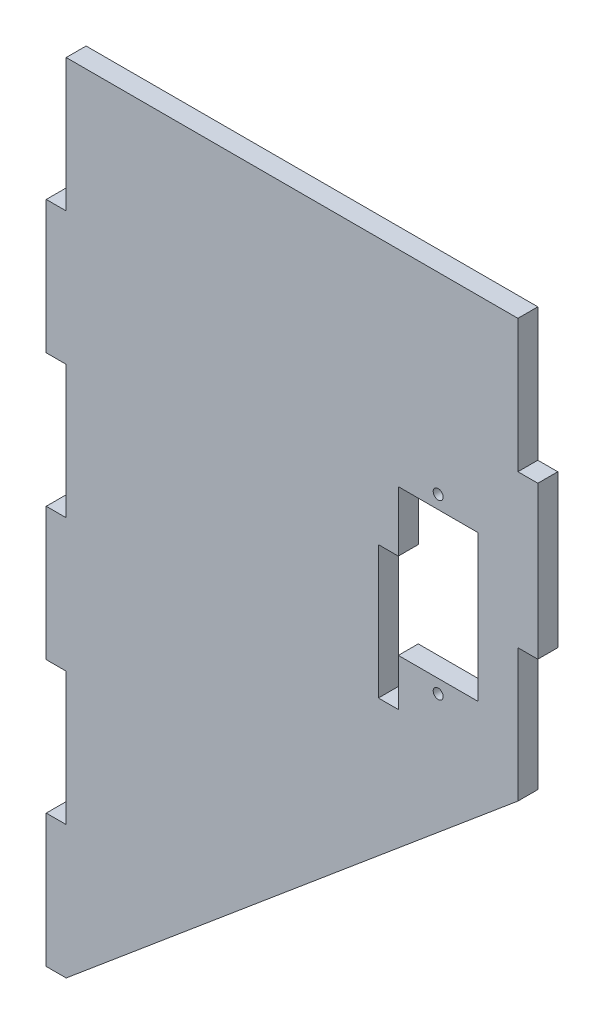
ISO-10303-21;
HEADER;
FILE_DESCRIPTION(('STEP AP214'),'2;1');
FILE_NAME('part.step','',(''),(''),'','','');
FILE_SCHEMA(('AUTOMOTIVE_DESIGN { 1 0 10303 214 1 1 1 1 }'));
ENDSEC;
DATA;
#1=APPLICATION_CONTEXT('core data for automotive mechanical design processes');
#2=APPLICATION_PROTOCOL_DEFINITION('international standard','automotive_design',2000,#1);
#3=PRODUCT_CONTEXT('',#1,'mechanical');
#4=PRODUCT('Part','Part','',(#3));
#5=PRODUCT_RELATED_PRODUCT_CATEGORY('part','',(#4));
#6=PRODUCT_DEFINITION_FORMATION('','',#4);
#7=PRODUCT_DEFINITION_CONTEXT('part definition',#1,'design');
#8=PRODUCT_DEFINITION('design','',#6,#7);
#9=PRODUCT_DEFINITION_SHAPE('','',#8);
#10=(LENGTH_UNIT() NAMED_UNIT(*) SI_UNIT(.MILLI.,.METRE.));
#11=(NAMED_UNIT(*) PLANE_ANGLE_UNIT() SI_UNIT($,.RADIAN.));
#12=(NAMED_UNIT(*) SI_UNIT($,.STERADIAN.) SOLID_ANGLE_UNIT());
#13=UNCERTAINTY_MEASURE_WITH_UNIT(LENGTH_MEASURE(1.E-05),#10,'distance_accuracy_value','');
#14=(GEOMETRIC_REPRESENTATION_CONTEXT(3) GLOBAL_UNCERTAINTY_ASSIGNED_CONTEXT((#13)) GLOBAL_UNIT_ASSIGNED_CONTEXT((#10,
#11,#12)) REPRESENTATION_CONTEXT('',''));
#15=CARTESIAN_POINT('',(0.,0.,0.));
#16=DIRECTION('',(0.,0.,1.));
#17=DIRECTION('',(1.,0.,0.));
#18=AXIS2_PLACEMENT_3D('',#15,#16,#17);
#19=CARTESIAN_POINT('',(0.,0.,3.));
#20=DIRECTION('',(0.,0.,-1.));
#21=DIRECTION('',(-1.,0.,0.));
#22=AXIS2_PLACEMENT_3D('',#19,#20,#21);
#23=PLANE('',#22);
#24=DIRECTION('',(1.,0.,0.));
#25=VECTOR('',#24,1.);
#26=CARTESIAN_POINT('',(-3.00000000000001,40.,3.));
#27=LINE('',#26,#25);
#28=CARTESIAN_POINT('',(-3.00000000000001,40.,3.));
#29=VERTEX_POINT('',#28);
#30=CARTESIAN_POINT('',(0.,40.,3.));
#31=VERTEX_POINT('',#30);
#32=EDGE_CURVE('E280',#29,#31,#27,.T.);
#33=ORIENTED_EDGE('',*,*,#32,.T.);
#34=DIRECTION('',(0.,-1.,0.));
#35=VECTOR('',#34,1.);
#36=CARTESIAN_POINT('',(0.,40.,3.));
#37=LINE('',#36,#35);
#38=CARTESIAN_POINT('',(0.,20.,3.));
#39=VERTEX_POINT('',#38);
#40=EDGE_CURVE('E283',#31,#39,#37,.T.);
#41=ORIENTED_EDGE('',*,*,#40,.T.);
#42=DIRECTION('',(-1.,0.,0.));
#43=VECTOR('',#42,1.);
#44=CARTESIAN_POINT('',(0.,20.,3.));
#45=LINE('',#44,#43);
#46=CARTESIAN_POINT('',(-3.,20.,3.));
#47=VERTEX_POINT('',#46);
#48=EDGE_CURVE('E286',#39,#47,#45,.T.);
#49=ORIENTED_EDGE('',*,*,#48,.T.);
#50=DIRECTION('',(0.,-1.,0.));
#51=VECTOR('',#50,1.);
#52=CARTESIAN_POINT('',(-3.,20.,3.));
#53=LINE('',#52,#51);
#54=CARTESIAN_POINT('',(-3.,0.,3.));
#55=VERTEX_POINT('',#54);
#56=EDGE_CURVE('E288',#47,#55,#53,.T.);
#57=ORIENTED_EDGE('',*,*,#56,.T.);
#58=DIRECTION('',(1.,0.,0.));
#59=VECTOR('',#58,1.);
#60=CARTESIAN_POINT('',(-3.,0.,3.));
#61=LINE('',#60,#59);
#62=CARTESIAN_POINT('',(0.,0.,3.));
#63=VERTEX_POINT('',#62);
#64=EDGE_CURVE('E290',#55,#63,#61,.T.);
#65=ORIENTED_EDGE('',*,*,#64,.T.);
#66=DIRECTION('',(0.766044443118977,0.642787609686541,0.));
#67=VECTOR('',#66,1.);
#68=CARTESIAN_POINT('',(0.,0.,3.));
#69=LINE('',#68,#67);
#70=CARTESIAN_POINT('',(68.,57.0587749200552,3.));
#71=VERTEX_POINT('',#70);
#72=EDGE_CURVE('E292',#63,#71,#69,.T.);
#73=ORIENTED_EDGE('',*,*,#72,.T.);
#74=DIRECTION('',(0.,1.,0.));
#75=VECTOR('',#74,1.);
#76=CARTESIAN_POINT('',(68.,57.0587749200552,3.));
#77=LINE('',#76,#75);
#78=CARTESIAN_POINT('',(68.,77.0587749200552,3.));
#79=VERTEX_POINT('',#78);
#80=EDGE_CURVE('E294',#71,#79,#77,.T.);
#81=ORIENTED_EDGE('',*,*,#80,.T.);
#82=DIRECTION('',(1.,0.,0.));
#83=VECTOR('',#82,1.);
#84=CARTESIAN_POINT('',(68.,77.0587749200552,3.));
#85=LINE('',#84,#83);
#86=CARTESIAN_POINT('',(71.,77.0587749200552,3.));
#87=VERTEX_POINT('',#86);
#88=EDGE_CURVE('E296',#79,#87,#85,.T.);
#89=ORIENTED_EDGE('',*,*,#88,.T.);
#90=DIRECTION('',(0.,1.,0.));
#91=VECTOR('',#90,1.);
#92=CARTESIAN_POINT('',(71.,77.0587749200552,3.));
#93=LINE('',#92,#91);
#94=CARTESIAN_POINT('',(71.,100.,3.));
#95=VERTEX_POINT('',#94);
#96=EDGE_CURVE('E298',#87,#95,#93,.T.);
#97=ORIENTED_EDGE('',*,*,#96,.T.);
#98=DIRECTION('',(-1.,0.,0.));
#99=VECTOR('',#98,1.);
#100=CARTESIAN_POINT('',(71.,100.,3.));
#101=LINE('',#100,#99);
#102=CARTESIAN_POINT('',(68.,100.,3.));
#103=VERTEX_POINT('',#102);
#104=EDGE_CURVE('E300',#95,#103,#101,.T.);
#105=ORIENTED_EDGE('',*,*,#104,.T.);
#106=DIRECTION('',(0.,1.,0.));
#107=VECTOR('',#106,1.);
#108=CARTESIAN_POINT('',(68.,100.,3.));
#109=LINE('',#108,#107);
#110=CARTESIAN_POINT('',(68.,120.,3.));
#111=VERTEX_POINT('',#110);
#112=EDGE_CURVE('E302',#103,#111,#109,.T.);
#113=ORIENTED_EDGE('',*,*,#112,.T.);
#114=DIRECTION('',(-1.,0.,0.));
#115=VECTOR('',#114,1.);
#116=CARTESIAN_POINT('',(23.5,120.,3.));
#117=LINE('',#116,#115);
#118=CARTESIAN_POINT('',(0.,120.,3.));
#119=VERTEX_POINT('',#118);
#120=EDGE_CURVE('E304',#111,#119,#117,.T.);
#121=ORIENTED_EDGE('',*,*,#120,.T.);
#122=DIRECTION('',(0.,-1.,0.));
#123=VECTOR('',#122,1.);
#124=CARTESIAN_POINT('',(0.,100.,3.));
#125=LINE('',#124,#123);
#126=CARTESIAN_POINT('',(0.,100.,3.));
#127=VERTEX_POINT('',#126);
#128=EDGE_CURVE('E306',#119,#127,#125,.T.);
#129=ORIENTED_EDGE('',*,*,#128,.T.);
#130=DIRECTION('',(-1.,0.,0.));
#131=VECTOR('',#130,1.);
#132=CARTESIAN_POINT('',(-3.00000000000001,100.,3.));
#133=LINE('',#132,#131);
#134=CARTESIAN_POINT('',(-3.00000000000001,100.,3.));
#135=VERTEX_POINT('',#134);
#136=EDGE_CURVE('E308',#127,#135,#133,.T.);
#137=ORIENTED_EDGE('',*,*,#136,.T.);
#138=DIRECTION('',(0.,-1.,0.));
#139=VECTOR('',#138,1.);
#140=CARTESIAN_POINT('',(-3.,80.,3.));
#141=LINE('',#140,#139);
#142=CARTESIAN_POINT('',(-3.,80.,3.));
#143=VERTEX_POINT('',#142);
#144=EDGE_CURVE('E310',#135,#143,#141,.T.);
#145=ORIENTED_EDGE('',*,*,#144,.T.);
#146=DIRECTION('',(1.,0.,0.));
#147=VECTOR('',#146,1.);
#148=CARTESIAN_POINT('',(0.,80.,3.));
#149=LINE('',#148,#147);
#150=CARTESIAN_POINT('',(0.,80.,3.));
#151=VERTEX_POINT('',#150);
#152=EDGE_CURVE('E312',#143,#151,#149,.T.);
#153=ORIENTED_EDGE('',*,*,#152,.T.);
#154=DIRECTION('',(0.,-1.,0.));
#155=VECTOR('',#154,1.);
#156=CARTESIAN_POINT('',(0.,60.,3.));
#157=LINE('',#156,#155);
#158=CARTESIAN_POINT('',(0.,60.,3.));
#159=VERTEX_POINT('',#158);
#160=EDGE_CURVE('E314',#151,#159,#157,.T.);
#161=ORIENTED_EDGE('',*,*,#160,.T.);
#162=DIRECTION('',(-1.,0.,0.));
#163=VECTOR('',#162,1.);
#164=CARTESIAN_POINT('',(-3.00000000000001,60.,3.));
#165=LINE('',#164,#163);
#166=CARTESIAN_POINT('',(-3.00000000000001,60.,3.));
#167=VERTEX_POINT('',#166);
#168=EDGE_CURVE('E316',#159,#167,#165,.T.);
#169=ORIENTED_EDGE('',*,*,#168,.T.);
#170=DIRECTION('',(0.,-1.,0.));
#171=VECTOR('',#170,1.);
#172=CARTESIAN_POINT('',(-3.00000000000001,60.,3.));
#173=LINE('',#172,#171);
#174=EDGE_CURVE('E318',#167,#29,#173,.T.);
#175=ORIENTED_EDGE('',*,*,#174,.T.);
#176=EDGE_LOOP('',(#33,#41,#49,#57,#65,#73,#81,#89,#97,#105,#113,#121,#129,#137,#145,#153,#161,
#169,#175));
#177=FACE_BOUND('',#176,.T.);
#178=DIRECTION('',(0.,-1.,0.));
#179=VECTOR('',#178,1.);
#180=CARTESIAN_POINT('',(50.,89.0587749200552,3.));
#181=LINE('',#180,#179);
#182=CARTESIAN_POINT('',(50.,89.0587749200552,3.));
#183=VERTEX_POINT('',#182);
#184=CARTESIAN_POINT('',(50.,80.,3.));
#185=VERTEX_POINT('',#184);
#186=EDGE_CURVE('E212',#183,#185,#181,.T.);
#187=ORIENTED_EDGE('',*,*,#186,.F.);
#188=DIRECTION('',(-1.,0.,0.));
#189=VECTOR('',#188,1.);
#190=CARTESIAN_POINT('',(50.,89.0587749200552,3.));
#191=LINE('',#190,#189);
#192=CARTESIAN_POINT('',(62.,89.0587749200552,3.));
#193=VERTEX_POINT('',#192);
#194=EDGE_CURVE('E247',#193,#183,#191,.T.);
#195=ORIENTED_EDGE('',*,*,#194,.F.);
#196=DIRECTION('',(0.,1.,0.));
#197=VECTOR('',#196,1.);
#198=CARTESIAN_POINT('',(62.,89.0587749200552,3.));
#199=LINE('',#198,#197);
#200=CARTESIAN_POINT('',(62.,67.0587749200552,3.));
#201=VERTEX_POINT('',#200);
#202=EDGE_CURVE('E245',#201,#193,#199,.T.);
#203=ORIENTED_EDGE('',*,*,#202,.F.);
#204=DIRECTION('',(1.,0.,0.));
#205=VECTOR('',#204,1.);
#206=CARTESIAN_POINT('',(50.,67.0587749200552,3.));
#207=LINE('',#206,#205);
#208=CARTESIAN_POINT('',(50.,67.0587749200552,3.));
#209=VERTEX_POINT('',#208);
#210=EDGE_CURVE('E243',#209,#201,#207,.T.);
#211=ORIENTED_EDGE('',*,*,#210,.F.);
#212=DIRECTION('',(0.,1.,0.));
#213=VECTOR('',#212,1.);
#214=CARTESIAN_POINT('',(50.,60.,3.));
#215=LINE('',#214,#213);
#216=CARTESIAN_POINT('',(50.,60.,3.));
#217=VERTEX_POINT('',#216);
#218=EDGE_CURVE('E241',#217,#209,#215,.T.);
#219=ORIENTED_EDGE('',*,*,#218,.F.);
#220=DIRECTION('',(1.,0.,0.));
#221=VECTOR('',#220,1.);
#222=CARTESIAN_POINT('',(50.,60.,3.));
#223=LINE('',#222,#221);
#224=CARTESIAN_POINT('',(47.,60.,3.));
#225=VERTEX_POINT('',#224);
#226=EDGE_CURVE('E236',#225,#217,#223,.T.);
#227=ORIENTED_EDGE('',*,*,#226,.F.);
#228=DIRECTION('',(0.,-1.,0.));
#229=VECTOR('',#228,1.);
#230=CARTESIAN_POINT('',(47.,60.,3.));
#231=LINE('',#230,#229);
#232=CARTESIAN_POINT('',(47.,80.,3.));
#233=VERTEX_POINT('',#232);
#234=EDGE_CURVE('E234',#233,#225,#231,.T.);
#235=ORIENTED_EDGE('',*,*,#234,.F.);
#236=DIRECTION('',(-1.,0.,0.));
#237=VECTOR('',#236,1.);
#238=CARTESIAN_POINT('',(47.,80.,3.));
#239=LINE('',#238,#237);
#240=EDGE_CURVE('E220',#185,#233,#239,.T.);
#241=ORIENTED_EDGE('',*,*,#240,.F.);
#242=EDGE_LOOP('',(#187,#195,#203,#211,#219,#227,#235,#241));
#243=FACE_BOUND('',#242,.T.);
#244=CARTESIAN_POINT('',(56.,91.0587749200552,3.));
#245=DIRECTION('',(0.,0.,1.));
#246=DIRECTION('',(1.,0.,0.));
#247=AXIS2_PLACEMENT_3D('',#244,#245,#246);
#248=CIRCLE('',#247,0.749999999999999);
#249=CARTESIAN_POINT('',(56.75,91.0587749200552,3.));
#250=VERTEX_POINT('',#249);
#251=EDGE_CURVE('E250',#250,#250,#248,.T.);
#252=ORIENTED_EDGE('',*,*,#251,.F.);
#253=EDGE_LOOP('',(#252));
#254=FACE_BOUND('',#253,.T.);
#255=CARTESIAN_POINT('',(56.,65.0587749200552,3.));
#256=DIRECTION('',(0.,0.,1.));
#257=DIRECTION('',(-1.,0.,0.));
#258=AXIS2_PLACEMENT_3D('',#255,#256,#257);
#259=CIRCLE('',#258,0.749999999999999);
#260=CARTESIAN_POINT('',(55.25,65.0587749200552,3.));
#261=VERTEX_POINT('',#260);
#262=EDGE_CURVE('E772',#261,#261,#259,.T.);
#263=ORIENTED_EDGE('',*,*,#262,.F.);
#264=EDGE_LOOP('',(#263));
#265=FACE_BOUND('',#264,.T.);
#266=ADVANCED_FACE('F33',(#177,#243,#254,#265),#23,.F.);
#267=CARTESIAN_POINT('',(0.,0.,0.));
#268=DIRECTION('',(0.,0.,-1.));
#269=DIRECTION('',(-1.,0.,0.));
#270=AXIS2_PLACEMENT_3D('',#267,#268,#269);
#271=PLANE('',#270);
#272=CARTESIAN_POINT('',(56.,91.0587749200552,0.));
#273=DIRECTION('',(0.,0.,1.));
#274=DIRECTION('',(1.,0.,0.));
#275=AXIS2_PLACEMENT_3D('',#272,#273,#274);
#276=CIRCLE('',#275,0.749999999999999);
#277=CARTESIAN_POINT('',(56.75,91.0587749200552,0.));
#278=VERTEX_POINT('',#277);
#279=EDGE_CURVE('E778',#278,#278,#276,.T.);
#280=ORIENTED_EDGE('',*,*,#279,.T.);
#281=EDGE_LOOP('',(#280));
#282=FACE_BOUND('',#281,.T.);
#283=DIRECTION('',(1.,0.,0.));
#284=VECTOR('',#283,1.);
#285=CARTESIAN_POINT('',(-3.00000000000001,40.,0.));
#286=LINE('',#285,#284);
#287=CARTESIAN_POINT('',(-3.00000000000001,40.,0.));
#288=VERTEX_POINT('',#287);
#289=CARTESIAN_POINT('',(0.,40.,0.));
#290=VERTEX_POINT('',#289);
#291=EDGE_CURVE('E228',#288,#290,#286,.T.);
#292=ORIENTED_EDGE('',*,*,#291,.F.);
#293=DIRECTION('',(0.,-1.,0.));
#294=VECTOR('',#293,1.);
#295=CARTESIAN_POINT('',(-3.00000000000001,60.,0.));
#296=LINE('',#295,#294);
#297=CARTESIAN_POINT('',(-3.00000000000001,60.,0.));
#298=VERTEX_POINT('',#297);
#299=EDGE_CURVE('E284',#298,#288,#296,.T.);
#300=ORIENTED_EDGE('',*,*,#299,.F.);
#301=DIRECTION('',(-1.,0.,0.));
#302=VECTOR('',#301,1.);
#303=CARTESIAN_POINT('',(-3.00000000000001,60.,0.));
#304=LINE('',#303,#302);
#305=CARTESIAN_POINT('',(0.,60.,0.));
#306=VERTEX_POINT('',#305);
#307=EDGE_CURVE('E356',#306,#298,#304,.T.);
#308=ORIENTED_EDGE('',*,*,#307,.F.);
#309=DIRECTION('',(0.,-1.,0.));
#310=VECTOR('',#309,1.);
#311=CARTESIAN_POINT('',(0.,60.,0.));
#312=LINE('',#311,#310);
#313=CARTESIAN_POINT('',(0.,80.,0.));
#314=VERTEX_POINT('',#313);
#315=EDGE_CURVE('E354',#314,#306,#312,.T.);
#316=ORIENTED_EDGE('',*,*,#315,.F.);
#317=DIRECTION('',(1.,0.,0.));
#318=VECTOR('',#317,1.);
#319=CARTESIAN_POINT('',(0.,80.,0.));
#320=LINE('',#319,#318);
#321=CARTESIAN_POINT('',(-3.,80.,0.));
#322=VERTEX_POINT('',#321);
#323=EDGE_CURVE('E352',#322,#314,#320,.T.);
#324=ORIENTED_EDGE('',*,*,#323,.F.);
#325=DIRECTION('',(0.,-1.,0.));
#326=VECTOR('',#325,1.);
#327=CARTESIAN_POINT('',(-3.,80.,0.));
#328=LINE('',#327,#326);
#329=CARTESIAN_POINT('',(-3.00000000000001,100.,0.));
#330=VERTEX_POINT('',#329);
#331=EDGE_CURVE('E350',#330,#322,#328,.T.);
#332=ORIENTED_EDGE('',*,*,#331,.F.);
#333=DIRECTION('',(-1.,0.,0.));
#334=VECTOR('',#333,1.);
#335=CARTESIAN_POINT('',(-3.00000000000001,100.,0.));
#336=LINE('',#335,#334);
#337=CARTESIAN_POINT('',(0.,100.,0.));
#338=VERTEX_POINT('',#337);
#339=EDGE_CURVE('E348',#338,#330,#336,.T.);
#340=ORIENTED_EDGE('',*,*,#339,.F.);
#341=DIRECTION('',(0.,-1.,0.));
#342=VECTOR('',#341,1.);
#343=CARTESIAN_POINT('',(0.,100.,0.));
#344=LINE('',#343,#342);
#345=CARTESIAN_POINT('',(0.,120.,0.));
#346=VERTEX_POINT('',#345);
#347=EDGE_CURVE('E346',#346,#338,#344,.T.);
#348=ORIENTED_EDGE('',*,*,#347,.F.);
#349=DIRECTION('',(-1.,0.,0.));
#350=VECTOR('',#349,1.);
#351=CARTESIAN_POINT('',(0.,120.,0.));
#352=LINE('',#351,#350);
#353=CARTESIAN_POINT('',(68.,120.,0.));
#354=VERTEX_POINT('',#353);
#355=EDGE_CURVE('E344',#354,#346,#352,.T.);
#356=ORIENTED_EDGE('',*,*,#355,.F.);
#357=DIRECTION('',(0.,1.,0.));
#358=VECTOR('',#357,1.);
#359=CARTESIAN_POINT('',(68.,100.,0.));
#360=LINE('',#359,#358);
#361=CARTESIAN_POINT('',(68.,100.,0.));
#362=VERTEX_POINT('',#361);
#363=EDGE_CURVE('E341',#362,#354,#360,.T.);
#364=ORIENTED_EDGE('',*,*,#363,.F.);
#365=DIRECTION('',(-1.,0.,0.));
#366=VECTOR('',#365,1.);
#367=CARTESIAN_POINT('',(71.,100.,0.));
#368=LINE('',#367,#366);
#369=CARTESIAN_POINT('',(71.,100.,0.));
#370=VERTEX_POINT('',#369);
#371=EDGE_CURVE('E339',#370,#362,#368,.T.);
#372=ORIENTED_EDGE('',*,*,#371,.F.);
#373=DIRECTION('',(0.,1.,0.));
#374=VECTOR('',#373,1.);
#375=CARTESIAN_POINT('',(71.,77.0587749200552,0.));
#376=LINE('',#375,#374);
#377=CARTESIAN_POINT('',(71.,77.0587749200552,0.));
#378=VERTEX_POINT('',#377);
#379=EDGE_CURVE('E337',#378,#370,#376,.T.);
#380=ORIENTED_EDGE('',*,*,#379,.F.);
#381=DIRECTION('',(1.,0.,0.));
#382=VECTOR('',#381,1.);
#383=CARTESIAN_POINT('',(68.,77.0587749200552,0.));
#384=LINE('',#383,#382);
#385=CARTESIAN_POINT('',(68.,77.0587749200552,0.));
#386=VERTEX_POINT('',#385);
#387=EDGE_CURVE('E335',#386,#378,#384,.T.);
#388=ORIENTED_EDGE('',*,*,#387,.F.);
#389=DIRECTION('',(0.,1.,0.));
#390=VECTOR('',#389,1.);
#391=CARTESIAN_POINT('',(68.,57.0587749200552,0.));
#392=LINE('',#391,#390);
#393=CARTESIAN_POINT('',(68.,57.0587749200552,0.));
#394=VERTEX_POINT('',#393);
#395=EDGE_CURVE('E333',#394,#386,#392,.T.);
#396=ORIENTED_EDGE('',*,*,#395,.F.);
#397=DIRECTION('',(0.766044443118977,0.642787609686541,0.));
#398=VECTOR('',#397,1.);
#399=CARTESIAN_POINT('',(0.,0.,0.));
#400=LINE('',#399,#398);
#401=CARTESIAN_POINT('',(0.,0.,0.));
#402=VERTEX_POINT('',#401);
#403=EDGE_CURVE('E331',#402,#394,#400,.T.);
#404=ORIENTED_EDGE('',*,*,#403,.F.);
#405=DIRECTION('',(1.,0.,0.));
#406=VECTOR('',#405,1.);
#407=CARTESIAN_POINT('',(-3.,0.,0.));
#408=LINE('',#407,#406);
#409=CARTESIAN_POINT('',(-3.,0.,0.));
#410=VERTEX_POINT('',#409);
#411=EDGE_CURVE('E329',#410,#402,#408,.T.);
#412=ORIENTED_EDGE('',*,*,#411,.F.);
#413=DIRECTION('',(0.,-1.,0.));
#414=VECTOR('',#413,1.);
#415=CARTESIAN_POINT('',(-3.,20.,0.));
#416=LINE('',#415,#414);
#417=CARTESIAN_POINT('',(-3.,20.,0.));
#418=VERTEX_POINT('',#417);
#419=EDGE_CURVE('E327',#418,#410,#416,.T.);
#420=ORIENTED_EDGE('',*,*,#419,.F.);
#421=DIRECTION('',(-1.,0.,0.));
#422=VECTOR('',#421,1.);
#423=CARTESIAN_POINT('',(0.,20.,0.));
#424=LINE('',#423,#422);
#425=CARTESIAN_POINT('',(0.,20.,0.));
#426=VERTEX_POINT('',#425);
#427=EDGE_CURVE('E325',#426,#418,#424,.T.);
#428=ORIENTED_EDGE('',*,*,#427,.F.);
#429=DIRECTION('',(0.,-1.,0.));
#430=VECTOR('',#429,1.);
#431=CARTESIAN_POINT('',(0.,40.,0.));
#432=LINE('',#431,#430);
#433=EDGE_CURVE('E323',#290,#426,#432,.T.);
#434=ORIENTED_EDGE('',*,*,#433,.F.);
#435=EDGE_LOOP('',(#292,#300,#308,#316,#324,#332,#340,#348,#356,#364,#372,#380,#388,#396,#404,
#412,#420,#428,#434));
#436=FACE_BOUND('',#435,.T.);
#437=DIRECTION('',(-1.,0.,0.));
#438=VECTOR('',#437,1.);
#439=CARTESIAN_POINT('',(50.,89.0587749200552,0.));
#440=LINE('',#439,#438);
#441=CARTESIAN_POINT('',(62.,89.0587749200552,0.));
#442=VERTEX_POINT('',#441);
#443=CARTESIAN_POINT('',(50.,89.0587749200552,0.));
#444=VERTEX_POINT('',#443);
#445=EDGE_CURVE('E221',#442,#444,#440,.T.);
#446=ORIENTED_EDGE('',*,*,#445,.T.);
#447=DIRECTION('',(0.,-1.,0.));
#448=VECTOR('',#447,1.);
#449=CARTESIAN_POINT('',(50.,89.0587749200552,0.));
#450=LINE('',#449,#448);
#451=CARTESIAN_POINT('',(50.,80.,0.));
#452=VERTEX_POINT('',#451);
#453=EDGE_CURVE('E56',#444,#452,#450,.T.);
#454=ORIENTED_EDGE('',*,*,#453,.T.);
#455=DIRECTION('',(-1.,0.,0.));
#456=VECTOR('',#455,1.);
#457=CARTESIAN_POINT('',(47.,80.,0.));
#458=LINE('',#457,#456);
#459=CARTESIAN_POINT('',(47.,80.,0.));
#460=VERTEX_POINT('',#459);
#461=EDGE_CURVE('E227',#452,#460,#458,.T.);
#462=ORIENTED_EDGE('',*,*,#461,.T.);
#463=DIRECTION('',(0.,-1.,0.));
#464=VECTOR('',#463,1.);
#465=CARTESIAN_POINT('',(47.,60.,0.));
#466=LINE('',#465,#464);
#467=CARTESIAN_POINT('',(47.,60.,0.));
#468=VERTEX_POINT('',#467);
#469=EDGE_CURVE('E252',#460,#468,#466,.T.);
#470=ORIENTED_EDGE('',*,*,#469,.T.);
#471=DIRECTION('',(1.,0.,0.));
#472=VECTOR('',#471,1.);
#473=CARTESIAN_POINT('',(50.,60.,0.));
#474=LINE('',#473,#472);
#475=CARTESIAN_POINT('',(50.,60.,0.));
#476=VERTEX_POINT('',#475);
#477=EDGE_CURVE('E255',#468,#476,#474,.T.);
#478=ORIENTED_EDGE('',*,*,#477,.T.);
#479=DIRECTION('',(0.,1.,0.));
#480=VECTOR('',#479,1.);
#481=CARTESIAN_POINT('',(50.,60.,0.));
#482=LINE('',#481,#480);
#483=CARTESIAN_POINT('',(50.,67.0587749200552,0.));
#484=VERTEX_POINT('',#483);
#485=EDGE_CURVE('E258',#476,#484,#482,.T.);
#486=ORIENTED_EDGE('',*,*,#485,.T.);
#487=DIRECTION('',(1.,0.,0.));
#488=VECTOR('',#487,1.);
#489=CARTESIAN_POINT('',(50.,67.0587749200552,0.));
#490=LINE('',#489,#488);
#491=CARTESIAN_POINT('',(62.,67.0587749200552,0.));
#492=VERTEX_POINT('',#491);
#493=EDGE_CURVE('E261',#484,#492,#490,.T.);
#494=ORIENTED_EDGE('',*,*,#493,.T.);
#495=DIRECTION('',(0.,1.,0.));
#496=VECTOR('',#495,1.);
#497=CARTESIAN_POINT('',(62.,89.0587749200552,0.));
#498=LINE('',#497,#496);
#499=EDGE_CURVE('E264',#492,#442,#498,.T.);
#500=ORIENTED_EDGE('',*,*,#499,.T.);
#501=EDGE_LOOP('',(#446,#454,#462,#470,#478,#486,#494,#500));
#502=FACE_BOUND('',#501,.T.);
#503=CARTESIAN_POINT('',(56.,65.0587749200552,0.));
#504=DIRECTION('',(0.,0.,1.));
#505=DIRECTION('',(-1.,0.,0.));
#506=AXIS2_PLACEMENT_3D('',#503,#504,#505);
#507=CIRCLE('',#506,0.749999999999999);
#508=CARTESIAN_POINT('',(55.25,65.0587749200552,0.));
#509=VERTEX_POINT('',#508);
#510=EDGE_CURVE('E775',#509,#509,#507,.T.);
#511=ORIENTED_EDGE('',*,*,#510,.T.);
#512=EDGE_LOOP('',(#511));
#513=FACE_BOUND('',#512,.T.);
#514=ADVANCED_FACE('F419',(#282,#436,#502,#513),#271,.T.);
#515=CARTESIAN_POINT('',(-3.00000000000001,40.,3.));
#516=DIRECTION('',(0.,1.,0.));
#517=DIRECTION('',(0.,0.,1.));
#518=AXIS2_PLACEMENT_3D('',#515,#516,#517);
#519=PLANE('',#518);
#520=ORIENTED_EDGE('',*,*,#291,.T.);
#521=DIRECTION('',(0.,0.,-1.));
#522=VECTOR('',#521,1.);
#523=CARTESIAN_POINT('',(0.,40.,3.));
#524=LINE('',#523,#522);
#525=EDGE_CURVE('E11',#31,#290,#524,.T.);
#526=ORIENTED_EDGE('',*,*,#525,.F.);
#527=ORIENTED_EDGE('',*,*,#32,.F.);
#528=DIRECTION('',(0.,0.,-1.));
#529=VECTOR('',#528,1.);
#530=CARTESIAN_POINT('',(-3.00000000000001,40.,3.));
#531=LINE('',#530,#529);
#532=EDGE_CURVE('E320',#29,#288,#531,.T.);
#533=ORIENTED_EDGE('',*,*,#532,.T.);
#534=EDGE_LOOP('',(#520,#526,#527,#533));
#535=FACE_BOUND('',#534,.T.);
#536=ADVANCED_FACE('F35',(#535),#519,.F.);
#537=CARTESIAN_POINT('',(0.,40.,3.));
#538=DIRECTION('',(1.,0.,0.));
#539=DIRECTION('',(0.,0.,-1.));
#540=AXIS2_PLACEMENT_3D('',#537,#538,#539);
#541=PLANE('',#540);
#542=ORIENTED_EDGE('',*,*,#433,.T.);
#543=DIRECTION('',(0.,0.,-1.));
#544=VECTOR('',#543,1.);
#545=CARTESIAN_POINT('',(0.,20.,3.));
#546=LINE('',#545,#544);
#547=EDGE_CURVE('E41',#39,#426,#546,.T.);
#548=ORIENTED_EDGE('',*,*,#547,.F.);
#549=ORIENTED_EDGE('',*,*,#40,.F.);
#550=ORIENTED_EDGE('',*,*,#525,.T.);
#551=EDGE_LOOP('',(#542,#548,#549,#550));
#552=FACE_BOUND('',#551,.T.);
#553=ADVANCED_FACE('F436',(#552),#541,.F.);
#554=CARTESIAN_POINT('',(0.,20.,3.));
#555=DIRECTION('',(0.,-1.,0.));
#556=DIRECTION('',(1.,0.,0.));
#557=AXIS2_PLACEMENT_3D('',#554,#555,#556);
#558=PLANE('',#557);
#559=ORIENTED_EDGE('',*,*,#427,.T.);
#560=DIRECTION('',(0.,0.,-1.));
#561=VECTOR('',#560,1.);
#562=CARTESIAN_POINT('',(-3.,20.,3.));
#563=LINE('',#562,#561);
#564=EDGE_CURVE('E406',#47,#418,#563,.T.);
#565=ORIENTED_EDGE('',*,*,#564,.F.);
#566=ORIENTED_EDGE('',*,*,#48,.F.);
#567=ORIENTED_EDGE('',*,*,#547,.T.);
#568=EDGE_LOOP('',(#559,#565,#566,#567));
#569=FACE_BOUND('',#568,.T.);
#570=ADVANCED_FACE('F413',(#569),#558,.F.);
#571=CARTESIAN_POINT('',(-3.,20.,3.));
#572=DIRECTION('',(1.,0.,0.));
#573=DIRECTION('',(0.,1.,0.));
#574=AXIS2_PLACEMENT_3D('',#571,#572,#573);
#575=PLANE('',#574);
#576=ORIENTED_EDGE('',*,*,#419,.T.);
#577=DIRECTION('',(0.,0.,-1.));
#578=VECTOR('',#577,1.);
#579=CARTESIAN_POINT('',(-3.,0.,3.));
#580=LINE('',#579,#578);
#581=EDGE_CURVE('E403',#55,#410,#580,.T.);
#582=ORIENTED_EDGE('',*,*,#581,.F.);
#583=ORIENTED_EDGE('',*,*,#56,.F.);
#584=ORIENTED_EDGE('',*,*,#564,.T.);
#585=EDGE_LOOP('',(#576,#582,#583,#584));
#586=FACE_BOUND('',#585,.T.);
#587=ADVANCED_FACE('F425',(#586),#575,.F.);
#588=CARTESIAN_POINT('',(-3.,0.,3.));
#589=DIRECTION('',(0.,1.,0.));
#590=DIRECTION('',(0.,0.,1.));
#591=AXIS2_PLACEMENT_3D('',#588,#589,#590);
#592=PLANE('',#591);
#593=ORIENTED_EDGE('',*,*,#411,.T.);
#594=DIRECTION('',(0.,0.,-1.));
#595=VECTOR('',#594,1.);
#596=CARTESIAN_POINT('',(0.,0.,3.));
#597=LINE('',#596,#595);
#598=EDGE_CURVE('E400',#63,#402,#597,.T.);
#599=ORIENTED_EDGE('',*,*,#598,.F.);
#600=ORIENTED_EDGE('',*,*,#64,.F.);
#601=ORIENTED_EDGE('',*,*,#581,.T.);
#602=EDGE_LOOP('',(#593,#599,#600,#601));
#603=FACE_BOUND('',#602,.T.);
#604=ADVANCED_FACE('F429',(#603),#592,.F.);
#605=CARTESIAN_POINT('',(0.,0.,3.));
#606=DIRECTION('',(-0.642787609686541,0.766044443118977,0.));
#607=DIRECTION('',(-0.766044443118977,-0.642787609686541,0.));
#608=AXIS2_PLACEMENT_3D('',#605,#606,#607);
#609=PLANE('',#608);
#610=ORIENTED_EDGE('',*,*,#403,.T.);
#611=DIRECTION('',(0.,0.,-1.));
#612=VECTOR('',#611,1.);
#613=CARTESIAN_POINT('',(68.,57.0587749200552,3.));
#614=LINE('',#613,#612);
#615=EDGE_CURVE('E397',#71,#394,#614,.T.);
#616=ORIENTED_EDGE('',*,*,#615,.F.);
#617=ORIENTED_EDGE('',*,*,#72,.F.);
#618=ORIENTED_EDGE('',*,*,#598,.T.);
#619=EDGE_LOOP('',(#610,#616,#617,#618));
#620=FACE_BOUND('',#619,.T.);
#621=ADVANCED_FACE('F503',(#620),#609,.F.);
#622=CARTESIAN_POINT('',(68.,57.0587749200552,3.));
#623=DIRECTION('',(-1.,0.,0.));
#624=DIRECTION('',(0.,0.,1.));
#625=AXIS2_PLACEMENT_3D('',#622,#623,#624);
#626=PLANE('',#625);
#627=ORIENTED_EDGE('',*,*,#395,.T.);
#628=DIRECTION('',(0.,0.,-1.));
#629=VECTOR('',#628,1.);
#630=CARTESIAN_POINT('',(68.,77.0587749200552,3.));
#631=LINE('',#630,#629);
#632=EDGE_CURVE('E394',#79,#386,#631,.T.);
#633=ORIENTED_EDGE('',*,*,#632,.F.);
#634=ORIENTED_EDGE('',*,*,#80,.F.);
#635=ORIENTED_EDGE('',*,*,#615,.T.);
#636=EDGE_LOOP('',(#627,#633,#634,#635));
#637=FACE_BOUND('',#636,.T.);
#638=ADVANCED_FACE('F500',(#637),#626,.F.);
#639=CARTESIAN_POINT('',(68.,77.0587749200552,3.));
#640=DIRECTION('',(0.,1.,0.));
#641=DIRECTION('',(-1.,0.,0.));
#642=AXIS2_PLACEMENT_3D('',#639,#640,#641);
#643=PLANE('',#642);
#644=ORIENTED_EDGE('',*,*,#387,.T.);
#645=DIRECTION('',(0.,0.,-1.));
#646=VECTOR('',#645,1.);
#647=CARTESIAN_POINT('',(71.,77.0587749200552,3.));
#648=LINE('',#647,#646);
#649=EDGE_CURVE('E391',#87,#378,#648,.T.);
#650=ORIENTED_EDGE('',*,*,#649,.F.);
#651=ORIENTED_EDGE('',*,*,#88,.F.);
#652=ORIENTED_EDGE('',*,*,#632,.T.);
#653=EDGE_LOOP('',(#644,#650,#651,#652));
#654=FACE_BOUND('',#653,.T.);
#655=ADVANCED_FACE('F496',(#654),#643,.F.);
#656=CARTESIAN_POINT('',(71.,77.0587749200552,3.));
#657=DIRECTION('',(-1.,0.,0.));
#658=DIRECTION('',(0.,0.,1.));
#659=AXIS2_PLACEMENT_3D('',#656,#657,#658);
#660=PLANE('',#659);
#661=ORIENTED_EDGE('',*,*,#379,.T.);
#662=DIRECTION('',(0.,0.,-1.));
#663=VECTOR('',#662,1.);
#664=CARTESIAN_POINT('',(71.,100.,3.));
#665=LINE('',#664,#663);
#666=EDGE_CURVE('E388',#95,#370,#665,.T.);
#667=ORIENTED_EDGE('',*,*,#666,.F.);
#668=ORIENTED_EDGE('',*,*,#96,.F.);
#669=ORIENTED_EDGE('',*,*,#649,.T.);
#670=EDGE_LOOP('',(#661,#667,#668,#669));
#671=FACE_BOUND('',#670,.T.);
#672=ADVANCED_FACE('F492',(#671),#660,.F.);
#673=CARTESIAN_POINT('',(71.,100.,3.));
#674=DIRECTION('',(0.,-1.,0.));
#675=DIRECTION('',(0.,0.,-1.));
#676=AXIS2_PLACEMENT_3D('',#673,#674,#675);
#677=PLANE('',#676);
#678=ORIENTED_EDGE('',*,*,#371,.T.);
#679=DIRECTION('',(0.,0.,-1.));
#680=VECTOR('',#679,1.);
#681=CARTESIAN_POINT('',(68.,100.,3.));
#682=LINE('',#681,#680);
#683=EDGE_CURVE('E385',#103,#362,#682,.T.);
#684=ORIENTED_EDGE('',*,*,#683,.F.);
#685=ORIENTED_EDGE('',*,*,#104,.F.);
#686=ORIENTED_EDGE('',*,*,#666,.T.);
#687=EDGE_LOOP('',(#678,#684,#685,#686));
#688=FACE_BOUND('',#687,.T.);
#689=ADVANCED_FACE('F487',(#688),#677,.F.);
#690=CARTESIAN_POINT('',(68.,100.,3.));
#691=DIRECTION('',(-1.,0.,0.));
#692=DIRECTION('',(0.,0.,1.));
#693=AXIS2_PLACEMENT_3D('',#690,#691,#692);
#694=PLANE('',#693);
#695=ORIENTED_EDGE('',*,*,#363,.T.);
#696=DIRECTION('',(0.,0.,-1.));
#697=VECTOR('',#696,1.);
#698=CARTESIAN_POINT('',(68.,120.,3.));
#699=LINE('',#698,#697);
#700=EDGE_CURVE('E382',#111,#354,#699,.T.);
#701=ORIENTED_EDGE('',*,*,#700,.F.);
#702=ORIENTED_EDGE('',*,*,#112,.F.);
#703=ORIENTED_EDGE('',*,*,#683,.T.);
#704=EDGE_LOOP('',(#695,#701,#702,#703));
#705=FACE_BOUND('',#704,.T.);
#706=ADVANCED_FACE('F481',(#705),#694,.F.);
#707=CARTESIAN_POINT('',(0.,120.,3.));
#708=DIRECTION('',(0.,-1.,0.));
#709=DIRECTION('',(1.,0.,0.));
#710=AXIS2_PLACEMENT_3D('',#707,#708,#709);
#711=PLANE('',#710);
#712=ORIENTED_EDGE('',*,*,#355,.T.);
#713=DIRECTION('',(0.,0.,-1.));
#714=VECTOR('',#713,1.);
#715=CARTESIAN_POINT('',(0.,120.,3.));
#716=LINE('',#715,#714);
#717=EDGE_CURVE('E379',#119,#346,#716,.T.);
#718=ORIENTED_EDGE('',*,*,#717,.F.);
#719=ORIENTED_EDGE('',*,*,#120,.F.);
#720=ORIENTED_EDGE('',*,*,#700,.T.);
#721=EDGE_LOOP('',(#712,#718,#719,#720));
#722=FACE_BOUND('',#721,.T.);
#723=ADVANCED_FACE('F477',(#722),#711,.F.);
#724=CARTESIAN_POINT('',(0.,100.,3.));
#725=DIRECTION('',(1.,0.,0.));
#726=DIRECTION('',(0.,0.,-1.));
#727=AXIS2_PLACEMENT_3D('',#724,#725,#726);
#728=PLANE('',#727);
#729=ORIENTED_EDGE('',*,*,#347,.T.);
#730=DIRECTION('',(0.,0.,-1.));
#731=VECTOR('',#730,1.);
#732=CARTESIAN_POINT('',(0.,100.,3.));
#733=LINE('',#732,#731);
#734=EDGE_CURVE('E376',#127,#338,#733,.T.);
#735=ORIENTED_EDGE('',*,*,#734,.F.);
#736=ORIENTED_EDGE('',*,*,#128,.F.);
#737=ORIENTED_EDGE('',*,*,#717,.T.);
#738=EDGE_LOOP('',(#729,#735,#736,#737));
#739=FACE_BOUND('',#738,.T.);
#740=ADVANCED_FACE('F472',(#739),#728,.F.);
#741=CARTESIAN_POINT('',(-3.00000000000001,100.,3.));
#742=DIRECTION('',(0.,-1.,0.));
#743=DIRECTION('',(0.,0.,-1.));
#744=AXIS2_PLACEMENT_3D('',#741,#742,#743);
#745=PLANE('',#744);
#746=ORIENTED_EDGE('',*,*,#339,.T.);
#747=DIRECTION('',(0.,0.,-1.));
#748=VECTOR('',#747,1.);
#749=CARTESIAN_POINT('',(-3.00000000000001,100.,3.));
#750=LINE('',#749,#748);
#751=EDGE_CURVE('E373',#135,#330,#750,.T.);
#752=ORIENTED_EDGE('',*,*,#751,.F.);
#753=ORIENTED_EDGE('',*,*,#136,.F.);
#754=ORIENTED_EDGE('',*,*,#734,.T.);
#755=EDGE_LOOP('',(#746,#752,#753,#754));
#756=FACE_BOUND('',#755,.T.);
#757=ADVANCED_FACE('F467',(#756),#745,.F.);
#758=CARTESIAN_POINT('',(-3.,80.,3.));
#759=DIRECTION('',(1.,0.,0.));
#760=DIRECTION('',(0.,1.,0.));
#761=AXIS2_PLACEMENT_3D('',#758,#759,#760);
#762=PLANE('',#761);
#763=ORIENTED_EDGE('',*,*,#331,.T.);
#764=DIRECTION('',(0.,0.,-1.));
#765=VECTOR('',#764,1.);
#766=CARTESIAN_POINT('',(-3.,80.,3.));
#767=LINE('',#766,#765);
#768=EDGE_CURVE('E370',#143,#322,#767,.T.);
#769=ORIENTED_EDGE('',*,*,#768,.F.);
#770=ORIENTED_EDGE('',*,*,#144,.F.);
#771=ORIENTED_EDGE('',*,*,#751,.T.);
#772=EDGE_LOOP('',(#763,#769,#770,#771));
#773=FACE_BOUND('',#772,.T.);
#774=ADVANCED_FACE('F463',(#773),#762,.F.);
#775=CARTESIAN_POINT('',(0.,80.,3.));
#776=DIRECTION('',(0.,1.,0.));
#777=DIRECTION('',(0.,0.,1.));
#778=AXIS2_PLACEMENT_3D('',#775,#776,#777);
#779=PLANE('',#778);
#780=ORIENTED_EDGE('',*,*,#323,.T.);
#781=DIRECTION('',(0.,0.,-1.));
#782=VECTOR('',#781,1.);
#783=CARTESIAN_POINT('',(0.,80.,3.));
#784=LINE('',#783,#782);
#785=EDGE_CURVE('E367',#151,#314,#784,.T.);
#786=ORIENTED_EDGE('',*,*,#785,.F.);
#787=ORIENTED_EDGE('',*,*,#152,.F.);
#788=ORIENTED_EDGE('',*,*,#768,.T.);
#789=EDGE_LOOP('',(#780,#786,#787,#788));
#790=FACE_BOUND('',#789,.T.);
#791=ADVANCED_FACE('F458',(#790),#779,.F.);
#792=CARTESIAN_POINT('',(0.,60.,3.));
#793=DIRECTION('',(1.,0.,0.));
#794=DIRECTION('',(0.,0.,-1.));
#795=AXIS2_PLACEMENT_3D('',#792,#793,#794);
#796=PLANE('',#795);
#797=ORIENTED_EDGE('',*,*,#315,.T.);
#798=DIRECTION('',(0.,0.,-1.));
#799=VECTOR('',#798,1.);
#800=CARTESIAN_POINT('',(0.,60.,3.));
#801=LINE('',#800,#799);
#802=EDGE_CURVE('E364',#159,#306,#801,.T.);
#803=ORIENTED_EDGE('',*,*,#802,.F.);
#804=ORIENTED_EDGE('',*,*,#160,.F.);
#805=ORIENTED_EDGE('',*,*,#785,.T.);
#806=EDGE_LOOP('',(#797,#803,#804,#805));
#807=FACE_BOUND('',#806,.T.);
#808=ADVANCED_FACE('F452',(#807),#796,.F.);
#809=CARTESIAN_POINT('',(-3.00000000000001,60.,3.));
#810=DIRECTION('',(0.,-1.,0.));
#811=DIRECTION('',(0.,0.,-1.));
#812=AXIS2_PLACEMENT_3D('',#809,#810,#811);
#813=PLANE('',#812);
#814=ORIENTED_EDGE('',*,*,#307,.T.);
#815=DIRECTION('',(0.,0.,-1.));
#816=VECTOR('',#815,1.);
#817=CARTESIAN_POINT('',(-3.00000000000001,60.,3.));
#818=LINE('',#817,#816);
#819=EDGE_CURVE('E361',#167,#298,#818,.T.);
#820=ORIENTED_EDGE('',*,*,#819,.F.);
#821=ORIENTED_EDGE('',*,*,#168,.F.);
#822=ORIENTED_EDGE('',*,*,#802,.T.);
#823=EDGE_LOOP('',(#814,#820,#821,#822));
#824=FACE_BOUND('',#823,.T.);
#825=ADVANCED_FACE('F448',(#824),#813,.F.);
#826=CARTESIAN_POINT('',(-3.00000000000001,60.,3.));
#827=DIRECTION('',(1.,0.,0.));
#828=DIRECTION('',(0.,0.,-1.));
#829=AXIS2_PLACEMENT_3D('',#826,#827,#828);
#830=PLANE('',#829);
#831=ORIENTED_EDGE('',*,*,#299,.T.);
#832=ORIENTED_EDGE('',*,*,#532,.F.);
#833=ORIENTED_EDGE('',*,*,#174,.F.);
#834=ORIENTED_EDGE('',*,*,#819,.T.);
#835=EDGE_LOOP('',(#831,#832,#833,#834));
#836=FACE_BOUND('',#835,.T.);
#837=ADVANCED_FACE('F443',(#836),#830,.F.);
#838=CARTESIAN_POINT('',(50.,89.0587749200552,3.));
#839=DIRECTION('',(1.,0.,0.));
#840=DIRECTION('',(0.,1.,0.));
#841=AXIS2_PLACEMENT_3D('',#838,#839,#840);
#842=PLANE('',#841);
#843=ORIENTED_EDGE('',*,*,#453,.F.);
#844=DIRECTION('',(0.,0.,-1.));
#845=VECTOR('',#844,1.);
#846=CARTESIAN_POINT('',(50.,89.0587749200552,3.));
#847=LINE('',#846,#845);
#848=EDGE_CURVE('E216',#183,#444,#847,.T.);
#849=ORIENTED_EDGE('',*,*,#848,.F.);
#850=ORIENTED_EDGE('',*,*,#186,.T.);
#851=DIRECTION('',(0.,0.,-1.));
#852=VECTOR('',#851,1.);
#853=CARTESIAN_POINT('',(50.,80.,3.));
#854=LINE('',#853,#852);
#855=EDGE_CURVE('E215',#185,#452,#854,.T.);
#856=ORIENTED_EDGE('',*,*,#855,.T.);
#857=EDGE_LOOP('',(#843,#849,#850,#856));
#858=FACE_BOUND('',#857,.T.);
#859=ADVANCED_FACE('F214',(#858),#842,.T.);
#860=CARTESIAN_POINT('',(47.,80.,3.));
#861=DIRECTION('',(0.,-1.,0.));
#862=DIRECTION('',(0.,0.,-1.));
#863=AXIS2_PLACEMENT_3D('',#860,#861,#862);
#864=PLANE('',#863);
#865=ORIENTED_EDGE('',*,*,#461,.F.);
#866=ORIENTED_EDGE('',*,*,#855,.F.);
#867=ORIENTED_EDGE('',*,*,#240,.T.);
#868=DIRECTION('',(0.,0.,-1.));
#869=VECTOR('',#868,1.);
#870=CARTESIAN_POINT('',(47.,80.,3.));
#871=LINE('',#870,#869);
#872=EDGE_CURVE('E229',#233,#460,#871,.T.);
#873=ORIENTED_EDGE('',*,*,#872,.T.);
#874=EDGE_LOOP('',(#865,#866,#867,#873));
#875=FACE_BOUND('',#874,.T.);
#876=ADVANCED_FACE('F224',(#875),#864,.T.);
#877=CARTESIAN_POINT('',(47.,60.,3.));
#878=DIRECTION('',(1.,0.,0.));
#879=DIRECTION('',(0.,1.,0.));
#880=AXIS2_PLACEMENT_3D('',#877,#878,#879);
#881=PLANE('',#880);
#882=ORIENTED_EDGE('',*,*,#469,.F.);
#883=ORIENTED_EDGE('',*,*,#872,.F.);
#884=ORIENTED_EDGE('',*,*,#234,.T.);
#885=DIRECTION('',(0.,0.,-1.));
#886=VECTOR('',#885,1.);
#887=CARTESIAN_POINT('',(47.,60.,3.));
#888=LINE('',#887,#886);
#889=EDGE_CURVE('E277',#225,#468,#888,.T.);
#890=ORIENTED_EDGE('',*,*,#889,.T.);
#891=EDGE_LOOP('',(#882,#883,#884,#890));
#892=FACE_BOUND('',#891,.T.);
#893=ADVANCED_FACE('F604',(#892),#881,.T.);
#894=CARTESIAN_POINT('',(50.,60.,3.));
#895=DIRECTION('',(0.,1.,0.));
#896=DIRECTION('',(0.,0.,1.));
#897=AXIS2_PLACEMENT_3D('',#894,#895,#896);
#898=PLANE('',#897);
#899=ORIENTED_EDGE('',*,*,#477,.F.);
#900=ORIENTED_EDGE('',*,*,#889,.F.);
#901=ORIENTED_EDGE('',*,*,#226,.T.);
#902=DIRECTION('',(0.,0.,-1.));
#903=VECTOR('',#902,1.);
#904=CARTESIAN_POINT('',(50.,60.,3.));
#905=LINE('',#904,#903);
#906=EDGE_CURVE('E275',#217,#476,#905,.T.);
#907=ORIENTED_EDGE('',*,*,#906,.T.);
#908=EDGE_LOOP('',(#899,#900,#901,#907));
#909=FACE_BOUND('',#908,.T.);
#910=ADVANCED_FACE('F610',(#909),#898,.T.);
#911=CARTESIAN_POINT('',(50.,60.,3.));
#912=DIRECTION('',(-1.,0.,0.));
#913=DIRECTION('',(0.,-1.,0.));
#914=AXIS2_PLACEMENT_3D('',#911,#912,#913);
#915=PLANE('',#914);
#916=ORIENTED_EDGE('',*,*,#485,.F.);
#917=ORIENTED_EDGE('',*,*,#906,.F.);
#918=ORIENTED_EDGE('',*,*,#218,.T.);
#919=DIRECTION('',(0.,0.,-1.));
#920=VECTOR('',#919,1.);
#921=CARTESIAN_POINT('',(50.,67.0587749200552,3.));
#922=LINE('',#921,#920);
#923=EDGE_CURVE('E273',#209,#484,#922,.T.);
#924=ORIENTED_EDGE('',*,*,#923,.T.);
#925=EDGE_LOOP('',(#916,#917,#918,#924));
#926=FACE_BOUND('',#925,.T.);
#927=ADVANCED_FACE('F618',(#926),#915,.T.);
#928=CARTESIAN_POINT('',(50.,67.0587749200552,3.));
#929=DIRECTION('',(0.,1.,0.));
#930=DIRECTION('',(0.,0.,1.));
#931=AXIS2_PLACEMENT_3D('',#928,#929,#930);
#932=PLANE('',#931);
#933=ORIENTED_EDGE('',*,*,#493,.F.);
#934=ORIENTED_EDGE('',*,*,#923,.F.);
#935=ORIENTED_EDGE('',*,*,#210,.T.);
#936=DIRECTION('',(0.,0.,-1.));
#937=VECTOR('',#936,1.);
#938=CARTESIAN_POINT('',(62.,67.0587749200552,3.));
#939=LINE('',#938,#937);
#940=EDGE_CURVE('E271',#201,#492,#939,.T.);
#941=ORIENTED_EDGE('',*,*,#940,.T.);
#942=EDGE_LOOP('',(#933,#934,#935,#941));
#943=FACE_BOUND('',#942,.T.);
#944=ADVANCED_FACE('F626',(#943),#932,.T.);
#945=CARTESIAN_POINT('',(62.,89.0587749200552,3.));
#946=DIRECTION('',(-1.,0.,0.));
#947=DIRECTION('',(0.,0.,1.));
#948=AXIS2_PLACEMENT_3D('',#945,#946,#947);
#949=PLANE('',#948);
#950=ORIENTED_EDGE('',*,*,#499,.F.);
#951=ORIENTED_EDGE('',*,*,#940,.F.);
#952=ORIENTED_EDGE('',*,*,#202,.T.);
#953=DIRECTION('',(0.,0.,-1.));
#954=VECTOR('',#953,1.);
#955=CARTESIAN_POINT('',(62.,89.0587749200552,3.));
#956=LINE('',#955,#954);
#957=EDGE_CURVE('E48',#193,#442,#956,.T.);
#958=ORIENTED_EDGE('',*,*,#957,.T.);
#959=EDGE_LOOP('',(#950,#951,#952,#958));
#960=FACE_BOUND('',#959,.T.);
#961=ADVANCED_FACE('F634',(#960),#949,.T.);
#962=CARTESIAN_POINT('',(50.,89.0587749200552,3.));
#963=DIRECTION('',(0.,-1.,0.));
#964=DIRECTION('',(1.,0.,0.));
#965=AXIS2_PLACEMENT_3D('',#962,#963,#964);
#966=PLANE('',#965);
#967=ORIENTED_EDGE('',*,*,#445,.F.);
#968=ORIENTED_EDGE('',*,*,#957,.F.);
#969=ORIENTED_EDGE('',*,*,#194,.T.);
#970=ORIENTED_EDGE('',*,*,#848,.T.);
#971=EDGE_LOOP('',(#967,#968,#969,#970));
#972=FACE_BOUND('',#971,.T.);
#973=ADVANCED_FACE('F642',(#972),#966,.T.);
#974=CARTESIAN_POINT('',(56.,91.0587749200552,3.));
#975=DIRECTION('',(0.,0.,-1.));
#976=DIRECTION('',(-1.,0.,0.));
#977=AXIS2_PLACEMENT_3D('',#974,#975,#976);
#978=CYLINDRICAL_SURFACE('',#977,0.749999999999999);
#979=ORIENTED_EDGE('',*,*,#251,.T.);
#980=EDGE_LOOP('',(#979));
#981=FACE_BOUND('',#980,.T.);
#982=ORIENTED_EDGE('',*,*,#279,.F.);
#983=EDGE_LOOP('',(#982));
#984=FACE_BOUND('',#983,.T.);
#985=ADVANCED_FACE('F650',(#981,#984),#978,.F.);
#986=CARTESIAN_POINT('',(56.,65.0587749200552,3.));
#987=DIRECTION('',(0.,0.,-1.));
#988=DIRECTION('',(-1.,0.,0.));
#989=AXIS2_PLACEMENT_3D('',#986,#987,#988);
#990=CYLINDRICAL_SURFACE('',#989,0.749999999999999);
#991=ORIENTED_EDGE('',*,*,#262,.T.);
#992=EDGE_LOOP('',(#991));
#993=FACE_BOUND('',#992,.T.);
#994=ORIENTED_EDGE('',*,*,#510,.F.);
#995=EDGE_LOOP('',(#994));
#996=FACE_BOUND('',#995,.T.);
#997=ADVANCED_FACE('F657',(#993,#996),#990,.F.);
#998=CLOSED_SHELL('',(#266,#514,#536,#553,#570,#587,#604,#621,#638,#655,#672,#689,#706,#723,
#740,#757,#774,#791,#808,#825,#837,#859,#876,#893,#910,#927,#944,#961,#973,#985,#997));
#999=MANIFOLD_SOLID_BREP('B2',#998);
#1000=ADVANCED_BREP_SHAPE_REPRESENTATION('',(#18,#999),#14);
#1001=SHAPE_DEFINITION_REPRESENTATION(#9,#1000);
ENDSEC;
END-ISO-10303-21;
